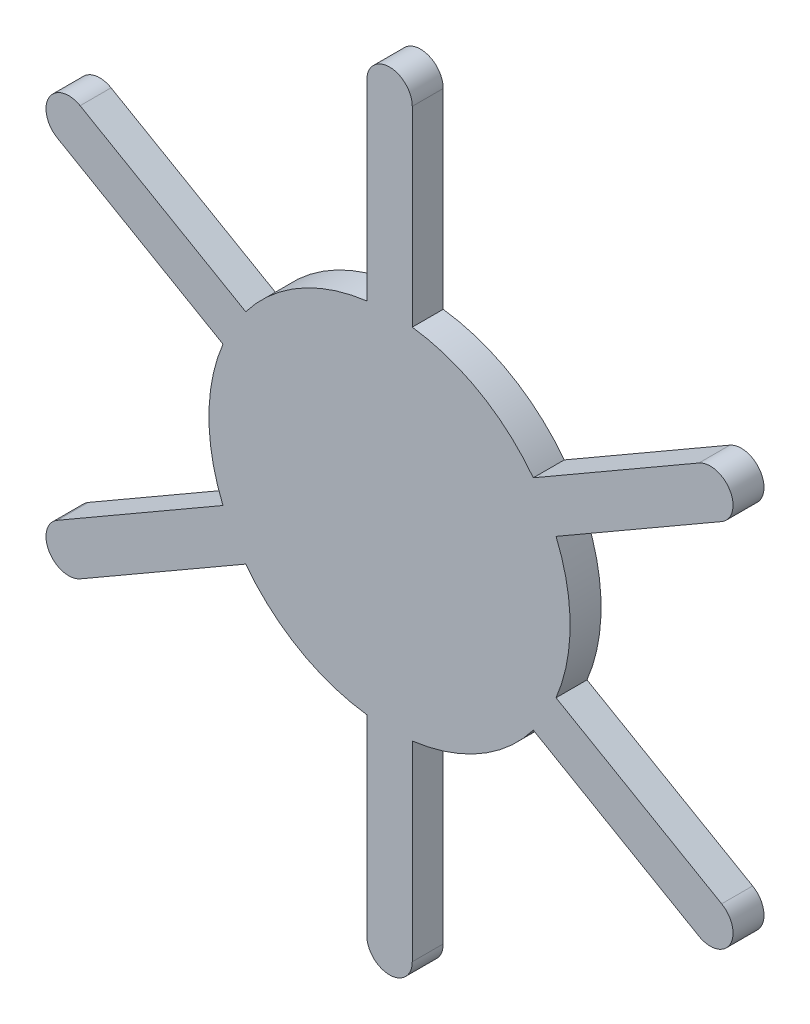
ISO-10303-21;
HEADER;
FILE_DESCRIPTION(('STEP AP214'),'2;1');
FILE_NAME('part.step','',(''),(''),'','','');
FILE_SCHEMA(('AUTOMOTIVE_DESIGN { 1 0 10303 214 1 1 1 1 }'));
ENDSEC;
DATA;
#1=APPLICATION_CONTEXT('core data for automotive mechanical design processes');
#2=APPLICATION_PROTOCOL_DEFINITION('international standard','automotive_design',2000,#1);
#3=PRODUCT_CONTEXT('',#1,'mechanical');
#4=PRODUCT('Part','Part','',(#3));
#5=PRODUCT_RELATED_PRODUCT_CATEGORY('part','',(#4));
#6=PRODUCT_DEFINITION_FORMATION('','',#4);
#7=PRODUCT_DEFINITION_CONTEXT('part definition',#1,'design');
#8=PRODUCT_DEFINITION('design','',#6,#7);
#9=PRODUCT_DEFINITION_SHAPE('','',#8);
#10=(LENGTH_UNIT() NAMED_UNIT(*) SI_UNIT(.MILLI.,.METRE.));
#11=(NAMED_UNIT(*) PLANE_ANGLE_UNIT() SI_UNIT($,.RADIAN.));
#12=(NAMED_UNIT(*) SI_UNIT($,.STERADIAN.) SOLID_ANGLE_UNIT());
#13=UNCERTAINTY_MEASURE_WITH_UNIT(LENGTH_MEASURE(1.E-05),#10,'distance_accuracy_value','');
#14=(GEOMETRIC_REPRESENTATION_CONTEXT(3) GLOBAL_UNCERTAINTY_ASSIGNED_CONTEXT((#13)) GLOBAL_UNIT_ASSIGNED_CONTEXT((#10,
#11,#12)) REPRESENTATION_CONTEXT('',''));
#15=CARTESIAN_POINT('',(0.,0.,0.));
#16=DIRECTION('',(0.,0.,1.));
#17=DIRECTION('',(1.,0.,0.));
#18=AXIS2_PLACEMENT_3D('',#15,#16,#17);
#19=CARTESIAN_POINT('',(0.,0.,15.));
#20=DIRECTION('',(0.,0.,-1.));
#21=DIRECTION('',(-1.,0.,0.));
#22=AXIS2_PLACEMENT_3D('',#19,#20,#21);
#23=CYLINDRICAL_SURFACE('',#22,175.);
#24=CARTESIAN_POINT('',(0.,0.,-15.));
#25=DIRECTION('',(0.,0.,1.));
#26=DIRECTION('',(1.,0.,0.));
#27=AXIS2_PLACEMENT_3D('',#24,#25,#26);
#28=CIRCLE('',#27,175.);
#29=CARTESIAN_POINT('',(-22.0336975206432,173.607362094955,-15.));
#30=VERTEX_POINT('',#29);
#31=CARTESIAN_POINT('',(-139.331537097901,105.885422839673,-15.));
#32=VERTEX_POINT('',#31);
#33=EDGE_CURVE('E229',#30,#32,#28,.T.);
#34=ORIENTED_EDGE('',*,*,#33,.T.);
#35=DIRECTION('',(0.,0.,-1.));
#36=VECTOR('',#35,1.);
#37=CARTESIAN_POINT('',(-139.331537097901,105.885422839673,15.));
#38=LINE('',#37,#36);
#39=CARTESIAN_POINT('',(-139.331537097901,105.885422839673,15.));
#40=VERTEX_POINT('',#39);
#41=EDGE_CURVE('E11',#40,#32,#38,.T.);
#42=ORIENTED_EDGE('',*,*,#41,.F.);
#43=CARTESIAN_POINT('',(0.,0.,15.));
#44=DIRECTION('',(0.,0.,1.));
#45=DIRECTION('',(1.,0.,0.));
#46=AXIS2_PLACEMENT_3D('',#43,#44,#45);
#47=CIRCLE('',#46,175.);
#48=CARTESIAN_POINT('',(-22.0336975206432,173.607362094955,15.));
#49=VERTEX_POINT('',#48);
#50=EDGE_CURVE('E275',#49,#40,#47,.T.);
#51=ORIENTED_EDGE('',*,*,#50,.F.);
#52=DIRECTION('',(0.,0.,-1.));
#53=VECTOR('',#52,1.);
#54=CARTESIAN_POINT('',(-22.0336975206432,173.607362094955,15.));
#55=LINE('',#54,#53);
#56=EDGE_CURVE('E225',#49,#30,#55,.T.);
#57=ORIENTED_EDGE('',*,*,#56,.T.);
#58=EDGE_LOOP('',(#34,#42,#51,#57));
#59=FACE_BOUND('',#58,.T.);
#60=ADVANCED_FACE('F37',(#59),#23,.T.);
#61=CARTESIAN_POINT('',(-299.814682012308,198.540409756403,15.));
#62=DIRECTION('',(-0.5,-0.866025403784439,0.));
#63=DIRECTION('',(0.866025403784439,-0.5,0.));
#64=AXIS2_PLACEMENT_3D('',#61,#62,#63);
#65=PLANE('',#64);
#66=DIRECTION('',(-0.866025403784439,0.5,0.));
#67=VECTOR('',#66,1.);
#68=CARTESIAN_POINT('',(-299.814682012308,198.540409756403,-15.));
#69=LINE('',#68,#67);
#70=CARTESIAN_POINT('',(-299.814682012308,198.540409756403,-15.));
#71=VERTEX_POINT('',#70);
#72=EDGE_CURVE('E232',#32,#71,#69,.T.);
#73=ORIENTED_EDGE('',*,*,#72,.T.);
#74=DIRECTION('',(0.,0.,-1.));
#75=VECTOR('',#74,1.);
#76=CARTESIAN_POINT('',(-299.814682012308,198.540409756403,15.));
#77=LINE('',#76,#75);
#78=CARTESIAN_POINT('',(-299.814682012308,198.540409756403,15.));
#79=VERTEX_POINT('',#78);
#80=EDGE_CURVE('E45',#79,#71,#77,.T.);
#81=ORIENTED_EDGE('',*,*,#80,.F.);
#82=DIRECTION('',(-0.866025403784439,0.5,0.));
#83=VECTOR('',#82,1.);
#84=CARTESIAN_POINT('',(-299.814682012308,198.540409756403,15.));
#85=LINE('',#84,#83);
#86=EDGE_CURVE('E144',#40,#79,#85,.T.);
#87=ORIENTED_EDGE('',*,*,#86,.F.);
#88=ORIENTED_EDGE('',*,*,#41,.T.);
#89=EDGE_LOOP('',(#73,#81,#87,#88));
#90=FACE_BOUND('',#89,.T.);
#91=ADVANCED_FACE('F413',(#90),#65,.F.);
#92=CARTESIAN_POINT('',(-310.83153077263,179.458667964222,15.));
#93=DIRECTION('',(0.,0.,-1.));
#94=DIRECTION('',(-1.,0.,0.));
#95=AXIS2_PLACEMENT_3D('',#92,#93,#94);
#96=CYLINDRICAL_SURFACE('',#95,22.033697520645);
#97=CARTESIAN_POINT('',(-310.83153077263,179.458667964222,-15.));
#98=DIRECTION('',(0.,0.,1.));
#99=DIRECTION('',(-1.,0.,0.));
#100=AXIS2_PLACEMENT_3D('',#97,#98,#99);
#101=CIRCLE('',#100,22.033697520645);
#102=CARTESIAN_POINT('',(-321.848379532953,160.376926172042,-15.));
#103=VERTEX_POINT('',#102);
#104=EDGE_CURVE('E234',#71,#103,#101,.T.);
#105=ORIENTED_EDGE('',*,*,#104,.T.);
#106=DIRECTION('',(0.,0.,-1.));
#107=VECTOR('',#106,1.);
#108=CARTESIAN_POINT('',(-321.848379532953,160.376926172042,15.));
#109=LINE('',#108,#107);
#110=CARTESIAN_POINT('',(-321.848379532953,160.376926172042,15.));
#111=VERTEX_POINT('',#110);
#112=EDGE_CURVE('E330',#111,#103,#109,.T.);
#113=ORIENTED_EDGE('',*,*,#112,.F.);
#114=CARTESIAN_POINT('',(-310.83153077263,179.458667964222,15.));
#115=DIRECTION('',(0.,0.,1.));
#116=DIRECTION('',(-1.,0.,0.));
#117=AXIS2_PLACEMENT_3D('',#114,#115,#116);
#118=CIRCLE('',#117,22.033697520645);
#119=EDGE_CURVE('E338',#79,#111,#118,.T.);
#120=ORIENTED_EDGE('',*,*,#119,.F.);
#121=ORIENTED_EDGE('',*,*,#80,.T.);
#122=EDGE_LOOP('',(#105,#113,#120,#121));
#123=FACE_BOUND('',#122,.T.);
#124=ADVANCED_FACE('F336',(#123),#96,.T.);
#125=CARTESIAN_POINT('',(-321.848379532953,160.376926172042,15.));
#126=DIRECTION('',(0.5,0.866025403784439,0.));
#127=DIRECTION('',(-0.866025403784439,0.5,0.));
#128=AXIS2_PLACEMENT_3D('',#125,#126,#127);
#129=PLANE('',#128);
#130=DIRECTION('',(0.866025403784439,-0.5,0.));
#131=VECTOR('',#130,1.);
#132=CARTESIAN_POINT('',(-321.848379532953,160.376926172042,-15.));
#133=LINE('',#132,#131);
#134=CARTESIAN_POINT('',(-161.36523461855,67.7219392553136,-15.));
#135=VERTEX_POINT('',#134);
#136=EDGE_CURVE('E236',#103,#135,#133,.T.);
#137=ORIENTED_EDGE('',*,*,#136,.T.);
#138=DIRECTION('',(0.,0.,-1.));
#139=VECTOR('',#138,1.);
#140=CARTESIAN_POINT('',(-161.36523461855,67.7219392553136,15.));
#141=LINE('',#140,#139);
#142=CARTESIAN_POINT('',(-161.36523461855,67.7219392553136,15.));
#143=VERTEX_POINT('',#142);
#144=EDGE_CURVE('E327',#143,#135,#141,.T.);
#145=ORIENTED_EDGE('',*,*,#144,.F.);
#146=DIRECTION('',(0.866025403784439,-0.5,0.));
#147=VECTOR('',#146,1.);
#148=CARTESIAN_POINT('',(-321.848379532953,160.376926172042,15.));
#149=LINE('',#148,#147);
#150=EDGE_CURVE('E356',#111,#143,#149,.T.);
#151=ORIENTED_EDGE('',*,*,#150,.F.);
#152=ORIENTED_EDGE('',*,*,#112,.T.);
#153=EDGE_LOOP('',(#137,#145,#151,#152));
#154=FACE_BOUND('',#153,.T.);
#155=ADVANCED_FACE('F347',(#154),#129,.F.);
#156=CARTESIAN_POINT('',(0.,0.,15.));
#157=DIRECTION('',(0.,0.,-1.));
#158=DIRECTION('',(-1.,0.,0.));
#159=AXIS2_PLACEMENT_3D('',#156,#157,#158);
#160=CYLINDRICAL_SURFACE('',#159,175.);
#161=CARTESIAN_POINT('',(0.,0.,-15.));
#162=DIRECTION('',(0.,0.,1.));
#163=DIRECTION('',(1.,0.,0.));
#164=AXIS2_PLACEMENT_3D('',#161,#162,#163);
#165=CIRCLE('',#164,175.);
#166=CARTESIAN_POINT('',(-161.365234618564,-67.7219392552787,-15.));
#167=VERTEX_POINT('',#166);
#168=EDGE_CURVE('E238',#135,#167,#165,.T.);
#169=ORIENTED_EDGE('',*,*,#168,.T.);
#170=DIRECTION('',(0.,0.,-1.));
#171=VECTOR('',#170,1.);
#172=CARTESIAN_POINT('',(-161.365234618564,-67.7219392552787,15.));
#173=LINE('',#172,#171);
#174=CARTESIAN_POINT('',(-161.365234618564,-67.7219392552787,15.));
#175=VERTEX_POINT('',#174);
#176=EDGE_CURVE('E324',#175,#167,#173,.T.);
#177=ORIENTED_EDGE('',*,*,#176,.F.);
#178=CARTESIAN_POINT('',(0.,0.,15.));
#179=DIRECTION('',(0.,0.,1.));
#180=DIRECTION('',(1.,0.,0.));
#181=AXIS2_PLACEMENT_3D('',#178,#179,#180);
#182=CIRCLE('',#181,175.);
#183=EDGE_CURVE('E353',#143,#175,#182,.T.);
#184=ORIENTED_EDGE('',*,*,#183,.F.);
#185=ORIENTED_EDGE('',*,*,#144,.T.);
#186=EDGE_LOOP('',(#169,#177,#184,#185));
#187=FACE_BOUND('',#186,.T.);
#188=ADVANCED_FACE('F351',(#187),#160,.T.);
#189=CARTESIAN_POINT('',(-161.365234618564,-67.7219392552788,15.));
#190=DIRECTION('',(0.5,-0.866025403784439,0.));
#191=DIRECTION('',(0.866025403784439,0.5,0.));
#192=AXIS2_PLACEMENT_3D('',#189,#190,#191);
#193=PLANE('',#192);
#194=DIRECTION('',(-0.866025403784438,-0.5,0.));
#195=VECTOR('',#194,1.);
#196=CARTESIAN_POINT('',(-161.365234618564,-67.7219392552788,-15.));
#197=LINE('',#196,#195);
#198=CARTESIAN_POINT('',(-321.848379532951,-160.376926171998,-15.));
#199=VERTEX_POINT('',#198);
#200=EDGE_CURVE('E240',#167,#199,#197,.T.);
#201=ORIENTED_EDGE('',*,*,#200,.T.);
#202=DIRECTION('',(0.,0.,-1.));
#203=VECTOR('',#202,1.);
#204=CARTESIAN_POINT('',(-321.848379532951,-160.376926171998,15.));
#205=LINE('',#204,#203);
#206=CARTESIAN_POINT('',(-321.848379532951,-160.376926171998,15.));
#207=VERTEX_POINT('',#206);
#208=EDGE_CURVE('E321',#207,#199,#205,.T.);
#209=ORIENTED_EDGE('',*,*,#208,.F.);
#210=DIRECTION('',(-0.866025403784438,-0.5,0.));
#211=VECTOR('',#210,1.);
#212=CARTESIAN_POINT('',(-161.365234618564,-67.7219392552788,15.));
#213=LINE('',#212,#211);
#214=EDGE_CURVE('E355',#175,#207,#213,.T.);
#215=ORIENTED_EDGE('',*,*,#214,.F.);
#216=ORIENTED_EDGE('',*,*,#176,.T.);
#217=EDGE_LOOP('',(#201,#209,#215,#216));
#218=FACE_BOUND('',#217,.T.);
#219=ADVANCED_FACE('F426',(#218),#193,.F.);
#220=CARTESIAN_POINT('',(-310.831530772629,-179.458667964179,15.));
#221=DIRECTION('',(0.,0.,-1.));
#222=DIRECTION('',(-1.,0.,0.));
#223=AXIS2_PLACEMENT_3D('',#220,#221,#222);
#224=CYLINDRICAL_SURFACE('',#223,22.0336975206446);
#225=CARTESIAN_POINT('',(-310.831530772629,-179.458667964179,-15.));
#226=DIRECTION('',(0.,0.,1.));
#227=DIRECTION('',(1.,0.,0.));
#228=AXIS2_PLACEMENT_3D('',#225,#226,#227);
#229=CIRCLE('',#228,22.0336975206446);
#230=CARTESIAN_POINT('',(-299.814682012306,-198.540409756359,-15.));
#231=VERTEX_POINT('',#230);
#232=EDGE_CURVE('E242',#199,#231,#229,.T.);
#233=ORIENTED_EDGE('',*,*,#232,.T.);
#234=DIRECTION('',(0.,0.,-1.));
#235=VECTOR('',#234,1.);
#236=CARTESIAN_POINT('',(-299.814682012306,-198.540409756359,15.));
#237=LINE('',#236,#235);
#238=CARTESIAN_POINT('',(-299.814682012306,-198.540409756359,15.));
#239=VERTEX_POINT('',#238);
#240=EDGE_CURVE('E318',#239,#231,#237,.T.);
#241=ORIENTED_EDGE('',*,*,#240,.F.);
#242=CARTESIAN_POINT('',(-310.831530772629,-179.458667964179,15.));
#243=DIRECTION('',(0.,0.,1.));
#244=DIRECTION('',(1.,0.,0.));
#245=AXIS2_PLACEMENT_3D('',#242,#243,#244);
#246=CIRCLE('',#245,22.0336975206446);
#247=EDGE_CURVE('E358',#207,#239,#246,.T.);
#248=ORIENTED_EDGE('',*,*,#247,.F.);
#249=ORIENTED_EDGE('',*,*,#208,.T.);
#250=EDGE_LOOP('',(#233,#241,#248,#249));
#251=FACE_BOUND('',#250,.T.);
#252=ADVANCED_FACE('F429',(#251),#224,.T.);
#253=CARTESIAN_POINT('',(-139.331537097924,-105.885422839642,15.));
#254=DIRECTION('',(-0.499999999999999,0.866025403784439,0.));
#255=DIRECTION('',(-0.866025403784439,-0.499999999999999,0.));
#256=AXIS2_PLACEMENT_3D('',#253,#254,#255);
#257=PLANE('',#256);
#258=DIRECTION('',(0.866025403784439,0.499999999999999,0.));
#259=VECTOR('',#258,1.);
#260=CARTESIAN_POINT('',(-139.331537097924,-105.885422839642,-15.));
#261=LINE('',#260,#259);
#262=CARTESIAN_POINT('',(-139.331537097924,-105.885422839642,-15.));
#263=VERTEX_POINT('',#262);
#264=EDGE_CURVE('E244',#231,#263,#261,.T.);
#265=ORIENTED_EDGE('',*,*,#264,.T.);
#266=DIRECTION('',(0.,0.,-1.));
#267=VECTOR('',#266,1.);
#268=CARTESIAN_POINT('',(-139.331537097924,-105.885422839642,15.));
#269=LINE('',#268,#267);
#270=CARTESIAN_POINT('',(-139.331537097924,-105.885422839642,15.));
#271=VERTEX_POINT('',#270);
#272=EDGE_CURVE('E315',#271,#263,#269,.T.);
#273=ORIENTED_EDGE('',*,*,#272,.F.);
#274=DIRECTION('',(0.866025403784439,0.499999999999999,0.));
#275=VECTOR('',#274,1.);
#276=CARTESIAN_POINT('',(-139.331537097924,-105.885422839642,15.));
#277=LINE('',#276,#275);
#278=EDGE_CURVE('E364',#239,#271,#277,.T.);
#279=ORIENTED_EDGE('',*,*,#278,.F.);
#280=ORIENTED_EDGE('',*,*,#240,.T.);
#281=EDGE_LOOP('',(#265,#273,#279,#280));
#282=FACE_BOUND('',#281,.T.);
#283=ADVANCED_FACE('F433',(#282),#257,.F.);
#284=CARTESIAN_POINT('',(0.,0.,15.));
#285=DIRECTION('',(0.,0.,-1.));
#286=DIRECTION('',(-1.,0.,0.));
#287=AXIS2_PLACEMENT_3D('',#284,#285,#286);
#288=CYLINDRICAL_SURFACE('',#287,175.);
#289=CARTESIAN_POINT('',(0.,0.,-15.));
#290=DIRECTION('',(0.,0.,1.));
#291=DIRECTION('',(1.,0.,0.));
#292=AXIS2_PLACEMENT_3D('',#289,#290,#291);
#293=CIRCLE('',#292,175.);
#294=CARTESIAN_POINT('',(-22.0336975206436,-173.607362094955,-15.));
#295=VERTEX_POINT('',#294);
#296=EDGE_CURVE('E246',#263,#295,#293,.T.);
#297=ORIENTED_EDGE('',*,*,#296,.T.);
#298=DIRECTION('',(0.,0.,-1.));
#299=VECTOR('',#298,1.);
#300=CARTESIAN_POINT('',(-22.0336975206436,-173.607362094955,15.));
#301=LINE('',#300,#299);
#302=CARTESIAN_POINT('',(-22.0336975206436,-173.607362094955,15.));
#303=VERTEX_POINT('',#302);
#304=EDGE_CURVE('E312',#303,#295,#301,.T.);
#305=ORIENTED_EDGE('',*,*,#304,.F.);
#306=CARTESIAN_POINT('',(0.,0.,15.));
#307=DIRECTION('',(0.,0.,1.));
#308=DIRECTION('',(1.,0.,0.));
#309=AXIS2_PLACEMENT_3D('',#306,#307,#308);
#310=CIRCLE('',#309,175.);
#311=EDGE_CURVE('E366',#271,#303,#310,.T.);
#312=ORIENTED_EDGE('',*,*,#311,.F.);
#313=ORIENTED_EDGE('',*,*,#272,.T.);
#314=EDGE_LOOP('',(#297,#305,#312,#313));
#315=FACE_BOUND('',#314,.T.);
#316=ADVANCED_FACE('F437',(#315),#288,.T.);
#317=CARTESIAN_POINT('',(-22.0336975206438,-358.917335928381,15.));
#318=DIRECTION('',(1.,0.,0.));
#319=DIRECTION('',(0.,1.,0.));
#320=AXIS2_PLACEMENT_3D('',#317,#318,#319);
#321=PLANE('',#320);
#322=DIRECTION('',(0.,-1.,0.));
#323=VECTOR('',#322,1.);
#324=CARTESIAN_POINT('',(-22.0336975206438,-358.917335928381,-15.));
#325=LINE('',#324,#323);
#326=CARTESIAN_POINT('',(-22.0336975206438,-358.917335928381,-15.));
#327=VERTEX_POINT('',#326);
#328=EDGE_CURVE('E248',#295,#327,#325,.T.);
#329=ORIENTED_EDGE('',*,*,#328,.T.);
#330=DIRECTION('',(0.,0.,-1.));
#331=VECTOR('',#330,1.);
#332=CARTESIAN_POINT('',(-22.0336975206438,-358.917335928381,15.));
#333=LINE('',#332,#331);
#334=CARTESIAN_POINT('',(-22.0336975206438,-358.917335928381,15.));
#335=VERTEX_POINT('',#334);
#336=EDGE_CURVE('E309',#335,#327,#333,.T.);
#337=ORIENTED_EDGE('',*,*,#336,.F.);
#338=DIRECTION('',(0.,-1.,0.));
#339=VECTOR('',#338,1.);
#340=CARTESIAN_POINT('',(-22.0336975206438,-358.917335928381,15.));
#341=LINE('',#340,#339);
#342=EDGE_CURVE('E368',#303,#335,#341,.T.);
#343=ORIENTED_EDGE('',*,*,#342,.F.);
#344=ORIENTED_EDGE('',*,*,#304,.T.);
#345=EDGE_LOOP('',(#329,#337,#343,#344));
#346=FACE_BOUND('',#345,.T.);
#347=ADVANCED_FACE('F441',(#346),#321,.F.);
#348=CARTESIAN_POINT('',(1.29518429255434E-12,-358.917335928381,15.));
#349=DIRECTION('',(0.,0.,-1.));
#350=DIRECTION('',(-1.,0.,0.));
#351=AXIS2_PLACEMENT_3D('',#348,#349,#350);
#352=CYLINDRICAL_SURFACE('',#351,22.033697520645);
#353=CARTESIAN_POINT('',(1.29518429255434E-12,-358.917335928381,-15.));
#354=DIRECTION('',(0.,0.,1.));
#355=DIRECTION('',(-1.,0.,0.));
#356=AXIS2_PLACEMENT_3D('',#353,#354,#355);
#357=CIRCLE('',#356,22.033697520645);
#358=CARTESIAN_POINT('',(22.0336975206463,-358.917335928382,-15.));
#359=VERTEX_POINT('',#358);
#360=EDGE_CURVE('E250',#327,#359,#357,.T.);
#361=ORIENTED_EDGE('',*,*,#360,.T.);
#362=DIRECTION('',(0.,0.,-1.));
#363=VECTOR('',#362,1.);
#364=CARTESIAN_POINT('',(22.0336975206463,-358.917335928382,15.));
#365=LINE('',#364,#363);
#366=CARTESIAN_POINT('',(22.0336975206463,-358.917335928382,15.));
#367=VERTEX_POINT('',#366);
#368=EDGE_CURVE('E306',#367,#359,#365,.T.);
#369=ORIENTED_EDGE('',*,*,#368,.F.);
#370=CARTESIAN_POINT('',(1.29518429255434E-12,-358.917335928381,15.));
#371=DIRECTION('',(0.,0.,1.));
#372=DIRECTION('',(-1.,0.,0.));
#373=AXIS2_PLACEMENT_3D('',#370,#371,#372);
#374=CIRCLE('',#373,22.033697520645);
#375=EDGE_CURVE('E370',#335,#367,#374,.T.);
#376=ORIENTED_EDGE('',*,*,#375,.F.);
#377=ORIENTED_EDGE('',*,*,#336,.T.);
#378=EDGE_LOOP('',(#361,#369,#376,#377));
#379=FACE_BOUND('',#378,.T.);
#380=ADVANCED_FACE('F445',(#379),#352,.T.);
#381=CARTESIAN_POINT('',(22.0336975206462,-358.917335928382,15.));
#382=DIRECTION('',(-1.,0.,0.));
#383=DIRECTION('',(0.,-1.,0.));
#384=AXIS2_PLACEMENT_3D('',#381,#382,#383);
#385=PLANE('',#384);
#386=DIRECTION('',(0.,1.,0.));
#387=VECTOR('',#386,1.);
#388=CARTESIAN_POINT('',(22.0336975206462,-358.917335928382,-15.));
#389=LINE('',#388,#387);
#390=CARTESIAN_POINT('',(22.0336975206462,-173.607362094955,-15.));
#391=VERTEX_POINT('',#390);
#392=EDGE_CURVE('E252',#359,#391,#389,.T.);
#393=ORIENTED_EDGE('',*,*,#392,.T.);
#394=DIRECTION('',(0.,0.,-1.));
#395=VECTOR('',#394,1.);
#396=CARTESIAN_POINT('',(22.0336975206462,-173.607362094955,15.));
#397=LINE('',#396,#395);
#398=CARTESIAN_POINT('',(22.0336975206462,-173.607362094955,15.));
#399=VERTEX_POINT('',#398);
#400=EDGE_CURVE('E303',#399,#391,#397,.T.);
#401=ORIENTED_EDGE('',*,*,#400,.F.);
#402=DIRECTION('',(0.,1.,0.));
#403=VECTOR('',#402,1.);
#404=CARTESIAN_POINT('',(22.0336975206462,-358.917335928382,15.));
#405=LINE('',#404,#403);
#406=EDGE_CURVE('E372',#367,#399,#405,.T.);
#407=ORIENTED_EDGE('',*,*,#406,.F.);
#408=ORIENTED_EDGE('',*,*,#368,.T.);
#409=EDGE_LOOP('',(#393,#401,#407,#408));
#410=FACE_BOUND('',#409,.T.);
#411=ADVANCED_FACE('F449',(#410),#385,.F.);
#412=CARTESIAN_POINT('',(0.,0.,15.));
#413=DIRECTION('',(0.,0.,-1.));
#414=DIRECTION('',(-1.,0.,0.));
#415=AXIS2_PLACEMENT_3D('',#412,#413,#414);
#416=CYLINDRICAL_SURFACE('',#415,175.);
#417=CARTESIAN_POINT('',(0.,0.,-15.));
#418=DIRECTION('',(0.,0.,1.));
#419=DIRECTION('',(1.,0.,0.));
#420=AXIS2_PLACEMENT_3D('',#417,#418,#419);
#421=CIRCLE('',#420,175.);
#422=CARTESIAN_POINT('',(139.331537097923,-105.885422839643,-15.));
#423=VERTEX_POINT('',#422);
#424=EDGE_CURVE('E254',#391,#423,#421,.T.);
#425=ORIENTED_EDGE('',*,*,#424,.T.);
#426=DIRECTION('',(0.,0.,-1.));
#427=VECTOR('',#426,1.);
#428=CARTESIAN_POINT('',(139.331537097923,-105.885422839643,15.));
#429=LINE('',#428,#427);
#430=CARTESIAN_POINT('',(139.331537097923,-105.885422839643,15.));
#431=VERTEX_POINT('',#430);
#432=EDGE_CURVE('E300',#431,#423,#429,.T.);
#433=ORIENTED_EDGE('',*,*,#432,.F.);
#434=CARTESIAN_POINT('',(0.,0.,15.));
#435=DIRECTION('',(0.,0.,1.));
#436=DIRECTION('',(1.,0.,0.));
#437=AXIS2_PLACEMENT_3D('',#434,#435,#436);
#438=CIRCLE('',#437,175.);
#439=EDGE_CURVE('E374',#399,#431,#438,.T.);
#440=ORIENTED_EDGE('',*,*,#439,.F.);
#441=ORIENTED_EDGE('',*,*,#400,.T.);
#442=EDGE_LOOP('',(#425,#433,#440,#441));
#443=FACE_BOUND('',#442,.T.);
#444=ADVANCED_FACE('F453',(#443),#416,.T.);
#445=CARTESIAN_POINT('',(139.331537097923,-105.885422839643,15.));
#446=DIRECTION('',(0.5,0.866025403784439,0.));
#447=DIRECTION('',(-0.866025403784439,0.5,0.));
#448=AXIS2_PLACEMENT_3D('',#445,#446,#447);
#449=PLANE('',#448);
#450=DIRECTION('',(0.866025403784439,-0.5,0.));
#451=VECTOR('',#450,1.);
#452=CARTESIAN_POINT('',(139.331537097923,-105.885422839643,-15.));
#453=LINE('',#452,#451);
#454=CARTESIAN_POINT('',(299.814682012306,-198.54040975636,-15.));
#455=VERTEX_POINT('',#454);
#456=EDGE_CURVE('E256',#423,#455,#453,.T.);
#457=ORIENTED_EDGE('',*,*,#456,.T.);
#458=DIRECTION('',(0.,0.,-1.));
#459=VECTOR('',#458,1.);
#460=CARTESIAN_POINT('',(299.814682012306,-198.54040975636,15.));
#461=LINE('',#460,#459);
#462=CARTESIAN_POINT('',(299.814682012306,-198.54040975636,15.));
#463=VERTEX_POINT('',#462);
#464=EDGE_CURVE('E297',#463,#455,#461,.T.);
#465=ORIENTED_EDGE('',*,*,#464,.F.);
#466=DIRECTION('',(0.866025403784439,-0.5,0.));
#467=VECTOR('',#466,1.);
#468=CARTESIAN_POINT('',(139.331537097923,-105.885422839643,15.));
#469=LINE('',#468,#467);
#470=EDGE_CURVE('E376',#431,#463,#469,.T.);
#471=ORIENTED_EDGE('',*,*,#470,.F.);
#472=ORIENTED_EDGE('',*,*,#432,.T.);
#473=EDGE_LOOP('',(#457,#465,#471,#472));
#474=FACE_BOUND('',#473,.T.);
#475=ADVANCED_FACE('F457',(#474),#449,.F.);
#476=CARTESIAN_POINT('',(310.831530772629,-179.45866796418,15.));
#477=DIRECTION('',(0.,0.,-1.));
#478=DIRECTION('',(-1.,0.,0.));
#479=AXIS2_PLACEMENT_3D('',#476,#477,#478);
#480=CYLINDRICAL_SURFACE('',#479,22.0336975206448);
#481=CARTESIAN_POINT('',(310.831530772629,-179.45866796418,-15.));
#482=DIRECTION('',(0.,0.,1.));
#483=DIRECTION('',(1.,0.,0.));
#484=AXIS2_PLACEMENT_3D('',#481,#482,#483);
#485=CIRCLE('',#484,22.0336975206448);
#486=CARTESIAN_POINT('',(321.848379532951,-160.376926171999,-15.));
#487=VERTEX_POINT('',#486);
#488=EDGE_CURVE('E258',#455,#487,#485,.T.);
#489=ORIENTED_EDGE('',*,*,#488,.T.);
#490=DIRECTION('',(0.,0.,-1.));
#491=VECTOR('',#490,1.);
#492=CARTESIAN_POINT('',(321.848379532951,-160.376926171999,15.));
#493=LINE('',#492,#491);
#494=CARTESIAN_POINT('',(321.848379532951,-160.376926171999,15.));
#495=VERTEX_POINT('',#494);
#496=EDGE_CURVE('E294',#495,#487,#493,.T.);
#497=ORIENTED_EDGE('',*,*,#496,.F.);
#498=CARTESIAN_POINT('',(310.831530772629,-179.45866796418,15.));
#499=DIRECTION('',(0.,0.,1.));
#500=DIRECTION('',(1.,0.,0.));
#501=AXIS2_PLACEMENT_3D('',#498,#499,#500);
#502=CIRCLE('',#501,22.0336975206448);
#503=EDGE_CURVE('E378',#463,#495,#502,.T.);
#504=ORIENTED_EDGE('',*,*,#503,.F.);
#505=ORIENTED_EDGE('',*,*,#464,.T.);
#506=EDGE_LOOP('',(#489,#497,#504,#505));
#507=FACE_BOUND('',#506,.T.);
#508=ADVANCED_FACE('F461',(#507),#480,.T.);
#509=CARTESIAN_POINT('',(161.365234618564,-67.7219392552798,15.));
#510=DIRECTION('',(-0.5,-0.866025403784438,0.));
#511=DIRECTION('',(0.866025403784438,-0.5,0.));
#512=AXIS2_PLACEMENT_3D('',#509,#510,#511);
#513=PLANE('',#512);
#514=DIRECTION('',(-0.866025403784438,0.5,0.));
#515=VECTOR('',#514,1.);
#516=CARTESIAN_POINT('',(161.365234618564,-67.7219392552798,-15.));
#517=LINE('',#516,#515);
#518=CARTESIAN_POINT('',(161.365234618564,-67.7219392552798,-15.));
#519=VERTEX_POINT('',#518);
#520=EDGE_CURVE('E260',#487,#519,#517,.T.);
#521=ORIENTED_EDGE('',*,*,#520,.T.);
#522=DIRECTION('',(0.,0.,-1.));
#523=VECTOR('',#522,1.);
#524=CARTESIAN_POINT('',(161.365234618564,-67.7219392552798,15.));
#525=LINE('',#524,#523);
#526=CARTESIAN_POINT('',(161.365234618564,-67.7219392552798,15.));
#527=VERTEX_POINT('',#526);
#528=EDGE_CURVE('E291',#527,#519,#525,.T.);
#529=ORIENTED_EDGE('',*,*,#528,.F.);
#530=DIRECTION('',(-0.866025403784438,0.5,0.));
#531=VECTOR('',#530,1.);
#532=CARTESIAN_POINT('',(161.365234618564,-67.7219392552798,15.));
#533=LINE('',#532,#531);
#534=EDGE_CURVE('E380',#495,#527,#533,.T.);
#535=ORIENTED_EDGE('',*,*,#534,.F.);
#536=ORIENTED_EDGE('',*,*,#496,.T.);
#537=EDGE_LOOP('',(#521,#529,#535,#536));
#538=FACE_BOUND('',#537,.T.);
#539=ADVANCED_FACE('F465',(#538),#513,.F.);
#540=CARTESIAN_POINT('',(0.,0.,15.));
#541=DIRECTION('',(0.,0.,-1.));
#542=DIRECTION('',(-1.,0.,0.));
#543=AXIS2_PLACEMENT_3D('',#540,#541,#542);
#544=CYLINDRICAL_SURFACE('',#543,175.);
#545=CARTESIAN_POINT('',(0.,0.,-15.));
#546=DIRECTION('',(0.,0.,1.));
#547=DIRECTION('',(1.,0.,0.));
#548=AXIS2_PLACEMENT_3D('',#545,#546,#547);
#549=CIRCLE('',#548,175.);
#550=CARTESIAN_POINT('',(161.365234618549,67.7219392553147,-15.));
#551=VERTEX_POINT('',#550);
#552=EDGE_CURVE('E262',#519,#551,#549,.T.);
#553=ORIENTED_EDGE('',*,*,#552,.T.);
#554=DIRECTION('',(0.,0.,-1.));
#555=VECTOR('',#554,1.);
#556=CARTESIAN_POINT('',(161.365234618549,67.7219392553147,15.));
#557=LINE('',#556,#555);
#558=CARTESIAN_POINT('',(161.365234618549,67.7219392553147,15.));
#559=VERTEX_POINT('',#558);
#560=EDGE_CURVE('E288',#559,#551,#557,.T.);
#561=ORIENTED_EDGE('',*,*,#560,.F.);
#562=CARTESIAN_POINT('',(0.,0.,15.));
#563=DIRECTION('',(0.,0.,1.));
#564=DIRECTION('',(1.,0.,0.));
#565=AXIS2_PLACEMENT_3D('',#562,#563,#564);
#566=CIRCLE('',#565,175.);
#567=EDGE_CURVE('E382',#527,#559,#566,.T.);
#568=ORIENTED_EDGE('',*,*,#567,.F.);
#569=ORIENTED_EDGE('',*,*,#528,.T.);
#570=EDGE_LOOP('',(#553,#561,#568,#569));
#571=FACE_BOUND('',#570,.T.);
#572=ADVANCED_FACE('F469',(#571),#544,.T.);
#573=CARTESIAN_POINT('',(321.848379532953,160.376926172043,15.));
#574=DIRECTION('',(-0.499999999999999,0.866025403784439,0.));
#575=DIRECTION('',(-0.866025403784439,-0.499999999999999,0.));
#576=AXIS2_PLACEMENT_3D('',#573,#574,#575);
#577=PLANE('',#576);
#578=DIRECTION('',(0.866025403784439,0.499999999999999,0.));
#579=VECTOR('',#578,1.);
#580=CARTESIAN_POINT('',(321.848379532953,160.376926172043,-15.));
#581=LINE('',#580,#579);
#582=CARTESIAN_POINT('',(321.848379532953,160.376926172043,-15.));
#583=VERTEX_POINT('',#582);
#584=EDGE_CURVE('E264',#551,#583,#581,.T.);
#585=ORIENTED_EDGE('',*,*,#584,.T.);
#586=DIRECTION('',(0.,0.,-1.));
#587=VECTOR('',#586,1.);
#588=CARTESIAN_POINT('',(321.848379532953,160.376926172043,15.));
#589=LINE('',#588,#587);
#590=CARTESIAN_POINT('',(321.848379532953,160.376926172043,15.));
#591=VERTEX_POINT('',#590);
#592=EDGE_CURVE('E285',#591,#583,#589,.T.);
#593=ORIENTED_EDGE('',*,*,#592,.F.);
#594=DIRECTION('',(0.866025403784439,0.499999999999999,0.));
#595=VECTOR('',#594,1.);
#596=CARTESIAN_POINT('',(321.848379532953,160.376926172043,15.));
#597=LINE('',#596,#595);
#598=EDGE_CURVE('E384',#559,#591,#597,.T.);
#599=ORIENTED_EDGE('',*,*,#598,.F.);
#600=ORIENTED_EDGE('',*,*,#560,.T.);
#601=EDGE_LOOP('',(#585,#593,#599,#600));
#602=FACE_BOUND('',#601,.T.);
#603=ADVANCED_FACE('F473',(#602),#577,.F.);
#604=CARTESIAN_POINT('',(310.83153077263,179.458667964224,15.));
#605=DIRECTION('',(0.,0.,-1.));
#606=DIRECTION('',(-1.,0.,0.));
#607=AXIS2_PLACEMENT_3D('',#604,#605,#606);
#608=CYLINDRICAL_SURFACE('',#607,22.033697520645);
#609=CARTESIAN_POINT('',(310.83153077263,179.458667964224,-15.));
#610=DIRECTION('',(0.,0.,1.));
#611=DIRECTION('',(-1.,0.,0.));
#612=AXIS2_PLACEMENT_3D('',#609,#610,#611);
#613=CIRCLE('',#612,22.033697520645);
#614=CARTESIAN_POINT('',(299.814682012308,198.540409756405,-15.));
#615=VERTEX_POINT('',#614);
#616=EDGE_CURVE('E266',#583,#615,#613,.T.);
#617=ORIENTED_EDGE('',*,*,#616,.T.);
#618=DIRECTION('',(0.,0.,-1.));
#619=VECTOR('',#618,1.);
#620=CARTESIAN_POINT('',(299.814682012308,198.540409756405,15.));
#621=LINE('',#620,#619);
#622=CARTESIAN_POINT('',(299.814682012308,198.540409756405,15.));
#623=VERTEX_POINT('',#622);
#624=EDGE_CURVE('E282',#623,#615,#621,.T.);
#625=ORIENTED_EDGE('',*,*,#624,.F.);
#626=CARTESIAN_POINT('',(310.83153077263,179.458667964224,15.));
#627=DIRECTION('',(0.,0.,1.));
#628=DIRECTION('',(-1.,0.,0.));
#629=AXIS2_PLACEMENT_3D('',#626,#627,#628);
#630=CIRCLE('',#629,22.033697520645);
#631=EDGE_CURVE('E386',#591,#623,#630,.T.);
#632=ORIENTED_EDGE('',*,*,#631,.F.);
#633=ORIENTED_EDGE('',*,*,#592,.T.);
#634=EDGE_LOOP('',(#617,#625,#632,#633));
#635=FACE_BOUND('',#634,.T.);
#636=ADVANCED_FACE('F477',(#635),#608,.T.);
#637=CARTESIAN_POINT('',(299.814682012308,198.540409756405,15.));
#638=DIRECTION('',(0.5,-0.866025403784438,0.));
#639=DIRECTION('',(0.866025403784439,0.5,0.));
#640=AXIS2_PLACEMENT_3D('',#637,#638,#639);
#641=PLANE('',#640);
#642=DIRECTION('',(-0.866025403784438,-0.5,0.));
#643=VECTOR('',#642,1.);
#644=CARTESIAN_POINT('',(299.814682012308,198.540409756405,-15.));
#645=LINE('',#644,#643);
#646=CARTESIAN_POINT('',(139.3315370979,105.885422839674,-15.));
#647=VERTEX_POINT('',#646);
#648=EDGE_CURVE('E268',#615,#647,#645,.T.);
#649=ORIENTED_EDGE('',*,*,#648,.T.);
#650=DIRECTION('',(0.,0.,-1.));
#651=VECTOR('',#650,1.);
#652=CARTESIAN_POINT('',(139.3315370979,105.885422839674,15.));
#653=LINE('',#652,#651);
#654=CARTESIAN_POINT('',(139.3315370979,105.885422839674,15.));
#655=VERTEX_POINT('',#654);
#656=EDGE_CURVE('E279',#655,#647,#653,.T.);
#657=ORIENTED_EDGE('',*,*,#656,.F.);
#658=DIRECTION('',(-0.866025403784438,-0.5,0.));
#659=VECTOR('',#658,1.);
#660=CARTESIAN_POINT('',(299.814682012308,198.540409756405,15.));
#661=LINE('',#660,#659);
#662=EDGE_CURVE('E388',#623,#655,#661,.T.);
#663=ORIENTED_EDGE('',*,*,#662,.F.);
#664=ORIENTED_EDGE('',*,*,#624,.T.);
#665=EDGE_LOOP('',(#649,#657,#663,#664));
#666=FACE_BOUND('',#665,.T.);
#667=ADVANCED_FACE('F394',(#666),#641,.F.);
#668=CARTESIAN_POINT('',(0.,0.,15.));
#669=DIRECTION('',(0.,0.,-1.));
#670=DIRECTION('',(-1.,0.,0.));
#671=AXIS2_PLACEMENT_3D('',#668,#669,#670);
#672=CYLINDRICAL_SURFACE('',#671,175.);
#673=CARTESIAN_POINT('',(0.,0.,-15.));
#674=DIRECTION('',(0.,0.,1.));
#675=DIRECTION('',(1.,0.,0.));
#676=AXIS2_PLACEMENT_3D('',#673,#674,#675);
#677=CIRCLE('',#676,175.);
#678=CARTESIAN_POINT('',(22.0336975206463,173.607362094955,-15.));
#679=VERTEX_POINT('',#678);
#680=EDGE_CURVE('E270',#647,#679,#677,.T.);
#681=ORIENTED_EDGE('',*,*,#680,.T.);
#682=DIRECTION('',(0.,0.,-1.));
#683=VECTOR('',#682,1.);
#684=CARTESIAN_POINT('',(22.0336975206463,173.607362094955,15.));
#685=LINE('',#684,#683);
#686=CARTESIAN_POINT('',(22.0336975206463,173.607362094955,15.));
#687=VERTEX_POINT('',#686);
#688=EDGE_CURVE('E220',#687,#679,#685,.T.);
#689=ORIENTED_EDGE('',*,*,#688,.F.);
#690=CARTESIAN_POINT('',(0.,0.,15.));
#691=DIRECTION('',(0.,0.,1.));
#692=DIRECTION('',(1.,0.,0.));
#693=AXIS2_PLACEMENT_3D('',#690,#691,#692);
#694=CIRCLE('',#693,175.);
#695=EDGE_CURVE('E211',#655,#687,#694,.T.);
#696=ORIENTED_EDGE('',*,*,#695,.F.);
#697=ORIENTED_EDGE('',*,*,#656,.T.);
#698=EDGE_LOOP('',(#681,#689,#696,#697));
#699=FACE_BOUND('',#698,.T.);
#700=ADVANCED_FACE('F398',(#699),#672,.T.);
#701=CARTESIAN_POINT('',(22.0336975206463,173.607362094955,15.));
#702=DIRECTION('',(-1.,0.,0.));
#703=DIRECTION('',(0.,-1.,0.));
#704=AXIS2_PLACEMENT_3D('',#701,#702,#703);
#705=PLANE('',#704);
#706=DIRECTION('',(0.,1.,0.));
#707=VECTOR('',#706,1.);
#708=CARTESIAN_POINT('',(22.0336975206463,173.607362094955,-15.));
#709=LINE('',#708,#707);
#710=CARTESIAN_POINT('',(22.0336975206463,358.917335928423,-15.));
#711=VERTEX_POINT('',#710);
#712=EDGE_CURVE('E219',#679,#711,#709,.T.);
#713=ORIENTED_EDGE('',*,*,#712,.T.);
#714=DIRECTION('',(0.,0.,-1.));
#715=VECTOR('',#714,1.);
#716=CARTESIAN_POINT('',(22.0336975206463,358.917335928423,15.));
#717=LINE('',#716,#715);
#718=CARTESIAN_POINT('',(22.0336975206463,358.917335928423,15.));
#719=VERTEX_POINT('',#718);
#720=EDGE_CURVE('E216',#719,#711,#717,.T.);
#721=ORIENTED_EDGE('',*,*,#720,.F.);
#722=DIRECTION('',(0.,1.,0.));
#723=VECTOR('',#722,1.);
#724=CARTESIAN_POINT('',(22.0336975206463,173.607362094955,15.));
#725=LINE('',#724,#723);
#726=EDGE_CURVE('E205',#687,#719,#725,.T.);
#727=ORIENTED_EDGE('',*,*,#726,.F.);
#728=ORIENTED_EDGE('',*,*,#688,.T.);
#729=EDGE_LOOP('',(#713,#721,#727,#728));
#730=FACE_BOUND('',#729,.T.);
#731=ADVANCED_FACE('F217',(#730),#705,.F.);
#732=CARTESIAN_POINT('',(1.46078868704059E-12,358.917335928423,15.));
#733=DIRECTION('',(0.,0.,-1.));
#734=DIRECTION('',(-1.,0.,0.));
#735=AXIS2_PLACEMENT_3D('',#732,#733,#734);
#736=CYLINDRICAL_SURFACE('',#735,22.0336975206447);
#737=CARTESIAN_POINT('',(1.46078868704059E-12,358.917335928423,-15.));
#738=DIRECTION('',(0.,0.,1.));
#739=DIRECTION('',(1.,0.,0.));
#740=AXIS2_PLACEMENT_3D('',#737,#738,#739);
#741=CIRCLE('',#740,22.0336975206447);
#742=CARTESIAN_POINT('',(-22.0336975206432,358.917335928423,-15.));
#743=VERTEX_POINT('',#742);
#744=EDGE_CURVE('E130',#711,#743,#741,.T.);
#745=ORIENTED_EDGE('',*,*,#744,.T.);
#746=DIRECTION('',(0.,0.,-1.));
#747=VECTOR('',#746,1.);
#748=CARTESIAN_POINT('',(-22.0336975206432,358.917335928423,15.));
#749=LINE('',#748,#747);
#750=CARTESIAN_POINT('',(-22.0336975206432,358.917335928423,15.));
#751=VERTEX_POINT('',#750);
#752=EDGE_CURVE('E221',#751,#743,#749,.T.);
#753=ORIENTED_EDGE('',*,*,#752,.F.);
#754=CARTESIAN_POINT('',(1.46078868704059E-12,358.917335928423,15.));
#755=DIRECTION('',(0.,0.,1.));
#756=DIRECTION('',(1.,0.,0.));
#757=AXIS2_PLACEMENT_3D('',#754,#755,#756);
#758=CIRCLE('',#757,22.0336975206447);
#759=EDGE_CURVE('E209',#719,#751,#758,.T.);
#760=ORIENTED_EDGE('',*,*,#759,.F.);
#761=ORIENTED_EDGE('',*,*,#720,.T.);
#762=EDGE_LOOP('',(#745,#753,#760,#761));
#763=FACE_BOUND('',#762,.T.);
#764=ADVANCED_FACE('F223',(#763),#736,.T.);
#765=CARTESIAN_POINT('',(-22.0336975206432,173.607362094955,15.));
#766=DIRECTION('',(1.,0.,0.));
#767=DIRECTION('',(0.,1.,0.));
#768=AXIS2_PLACEMENT_3D('',#765,#766,#767);
#769=PLANE('',#768);
#770=DIRECTION('',(0.,-1.,0.));
#771=VECTOR('',#770,1.);
#772=CARTESIAN_POINT('',(-22.0336975206432,173.607362094955,-15.));
#773=LINE('',#772,#771);
#774=EDGE_CURVE('E136',#743,#30,#773,.T.);
#775=ORIENTED_EDGE('',*,*,#774,.T.);
#776=ORIENTED_EDGE('',*,*,#56,.F.);
#777=DIRECTION('',(0.,-1.,0.));
#778=VECTOR('',#777,1.);
#779=CARTESIAN_POINT('',(-22.0336975206432,173.607362094955,15.));
#780=LINE('',#779,#778);
#781=EDGE_CURVE('E53',#751,#49,#780,.T.);
#782=ORIENTED_EDGE('',*,*,#781,.F.);
#783=ORIENTED_EDGE('',*,*,#752,.T.);
#784=EDGE_LOOP('',(#775,#776,#782,#783));
#785=FACE_BOUND('',#784,.T.);
#786=ADVANCED_FACE('F402',(#785),#769,.F.);
#787=CARTESIAN_POINT('',(0.,0.,15.));
#788=DIRECTION('',(0.,0.,1.));
#789=DIRECTION('',(1.,0.,0.));
#790=AXIS2_PLACEMENT_3D('',#787,#788,#789);
#791=PLANE('',#790);
#792=ORIENTED_EDGE('',*,*,#50,.T.);
#793=ORIENTED_EDGE('',*,*,#86,.T.);
#794=ORIENTED_EDGE('',*,*,#119,.T.);
#795=ORIENTED_EDGE('',*,*,#150,.T.);
#796=ORIENTED_EDGE('',*,*,#183,.T.);
#797=ORIENTED_EDGE('',*,*,#214,.T.);
#798=ORIENTED_EDGE('',*,*,#247,.T.);
#799=ORIENTED_EDGE('',*,*,#278,.T.);
#800=ORIENTED_EDGE('',*,*,#311,.T.);
#801=ORIENTED_EDGE('',*,*,#342,.T.);
#802=ORIENTED_EDGE('',*,*,#375,.T.);
#803=ORIENTED_EDGE('',*,*,#406,.T.);
#804=ORIENTED_EDGE('',*,*,#439,.T.);
#805=ORIENTED_EDGE('',*,*,#470,.T.);
#806=ORIENTED_EDGE('',*,*,#503,.T.);
#807=ORIENTED_EDGE('',*,*,#534,.T.);
#808=ORIENTED_EDGE('',*,*,#567,.T.);
#809=ORIENTED_EDGE('',*,*,#598,.T.);
#810=ORIENTED_EDGE('',*,*,#631,.T.);
#811=ORIENTED_EDGE('',*,*,#662,.T.);
#812=ORIENTED_EDGE('',*,*,#695,.T.);
#813=ORIENTED_EDGE('',*,*,#726,.T.);
#814=ORIENTED_EDGE('',*,*,#759,.T.);
#815=ORIENTED_EDGE('',*,*,#781,.T.);
#816=EDGE_LOOP('',(#792,#793,#794,#795,#796,#797,#798,#799,#800,#801,#802,#803,#804,#805,#806,
#807,#808,#809,#810,#811,#812,#813,#814,#815));
#817=FACE_BOUND('',#816,.T.);
#818=ADVANCED_FACE('F207',(#817),#791,.T.);
#819=CARTESIAN_POINT('',(0.,0.,-15.));
#820=DIRECTION('',(0.,0.,1.));
#821=DIRECTION('',(1.,0.,0.));
#822=AXIS2_PLACEMENT_3D('',#819,#820,#821);
#823=PLANE('',#822);
#824=ORIENTED_EDGE('',*,*,#33,.F.);
#825=ORIENTED_EDGE('',*,*,#774,.F.);
#826=ORIENTED_EDGE('',*,*,#744,.F.);
#827=ORIENTED_EDGE('',*,*,#712,.F.);
#828=ORIENTED_EDGE('',*,*,#680,.F.);
#829=ORIENTED_EDGE('',*,*,#648,.F.);
#830=ORIENTED_EDGE('',*,*,#616,.F.);
#831=ORIENTED_EDGE('',*,*,#584,.F.);
#832=ORIENTED_EDGE('',*,*,#552,.F.);
#833=ORIENTED_EDGE('',*,*,#520,.F.);
#834=ORIENTED_EDGE('',*,*,#488,.F.);
#835=ORIENTED_EDGE('',*,*,#456,.F.);
#836=ORIENTED_EDGE('',*,*,#424,.F.);
#837=ORIENTED_EDGE('',*,*,#392,.F.);
#838=ORIENTED_EDGE('',*,*,#360,.F.);
#839=ORIENTED_EDGE('',*,*,#328,.F.);
#840=ORIENTED_EDGE('',*,*,#296,.F.);
#841=ORIENTED_EDGE('',*,*,#264,.F.);
#842=ORIENTED_EDGE('',*,*,#232,.F.);
#843=ORIENTED_EDGE('',*,*,#200,.F.);
#844=ORIENTED_EDGE('',*,*,#168,.F.);
#845=ORIENTED_EDGE('',*,*,#136,.F.);
#846=ORIENTED_EDGE('',*,*,#104,.F.);
#847=ORIENTED_EDGE('',*,*,#72,.F.);
#848=EDGE_LOOP('',(#824,#825,#826,#827,#828,#829,#830,#831,#832,#833,#834,#835,#836,#837,#838,
#839,#840,#841,#842,#843,#844,#845,#846,#847));
#849=FACE_BOUND('',#848,.T.);
#850=ADVANCED_FACE('F342',(#849),#823,.F.);
#851=CLOSED_SHELL('',(#60,#91,#124,#155,#188,#219,#252,#283,#316,#347,#380,#411,#444,#475,#508,
#539,#572,#603,#636,#667,#700,#731,#764,#786,#818,#850));
#852=MANIFOLD_SOLID_BREP('B2',#851);
#853=ADVANCED_BREP_SHAPE_REPRESENTATION('',(#18,#852),#14);
#854=SHAPE_DEFINITION_REPRESENTATION(#9,#853);
ENDSEC;
END-ISO-10303-21;
